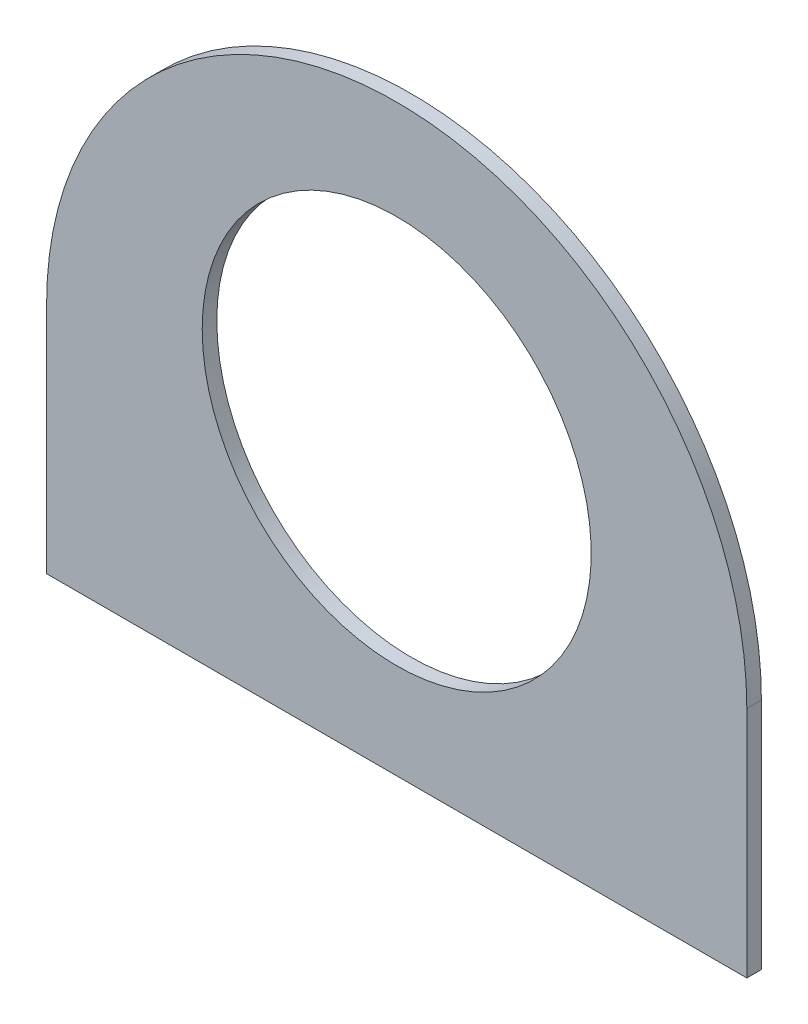
ISO-10303-21;
HEADER;
FILE_DESCRIPTION(('STEP AP214'),'2;1');
FILE_NAME('part.step','',(''),(''),'','','');
FILE_SCHEMA(('AUTOMOTIVE_DESIGN { 1 0 10303 214 1 1 1 1 }'));
ENDSEC;
DATA;
#1=APPLICATION_CONTEXT('core data for automotive mechanical design processes');
#2=APPLICATION_PROTOCOL_DEFINITION('international standard','automotive_design',2000,#1);
#3=PRODUCT_CONTEXT('',#1,'mechanical');
#4=PRODUCT('Part','Part','',(#3));
#5=PRODUCT_RELATED_PRODUCT_CATEGORY('part','',(#4));
#6=PRODUCT_DEFINITION_FORMATION('','',#4);
#7=PRODUCT_DEFINITION_CONTEXT('part definition',#1,'design');
#8=PRODUCT_DEFINITION('design','',#6,#7);
#9=PRODUCT_DEFINITION_SHAPE('','',#8);
#10=(LENGTH_UNIT() NAMED_UNIT(*) SI_UNIT(.MILLI.,.METRE.));
#11=(NAMED_UNIT(*) PLANE_ANGLE_UNIT() SI_UNIT($,.RADIAN.));
#12=(NAMED_UNIT(*) SI_UNIT($,.STERADIAN.) SOLID_ANGLE_UNIT());
#13=UNCERTAINTY_MEASURE_WITH_UNIT(LENGTH_MEASURE(1.E-05),#10,'distance_accuracy_value','');
#14=(GEOMETRIC_REPRESENTATION_CONTEXT(3) GLOBAL_UNCERTAINTY_ASSIGNED_CONTEXT((#13)) GLOBAL_UNIT_ASSIGNED_CONTEXT((#10,
#11,#12)) REPRESENTATION_CONTEXT('',''));
#15=CARTESIAN_POINT('',(0.,0.,0.));
#16=DIRECTION('',(0.,0.,1.));
#17=DIRECTION('',(1.,0.,0.));
#18=AXIS2_PLACEMENT_3D('',#15,#16,#17);
#19=CARTESIAN_POINT('',(0.,-36.83,9.525));
#20=DIRECTION('',(0.,0.,1.));
#21=DIRECTION('',(1.,0.,0.));
#22=AXIS2_PLACEMENT_3D('',#19,#20,#21);
#23=PLANE('',#22);
#24=DIRECTION('',(1.,0.,0.));
#25=VECTOR('',#24,1.);
#26=CARTESIAN_POINT('',(-228.6,-189.23,9.525));
#27=LINE('',#26,#25);
#28=CARTESIAN_POINT('',(-228.6,-189.23,9.525));
#29=VERTEX_POINT('',#28);
#30=CARTESIAN_POINT('',(228.6,-189.23,9.525));
#31=VERTEX_POINT('',#30);
#32=EDGE_CURVE('E85',#29,#31,#27,.T.);
#33=ORIENTED_EDGE('',*,*,#32,.T.);
#34=DIRECTION('',(0.,1.,0.));
#35=VECTOR('',#34,1.);
#36=CARTESIAN_POINT('',(228.6,-36.83,9.525));
#37=LINE('',#36,#35);
#38=CARTESIAN_POINT('',(228.6,-36.83,9.525));
#39=VERTEX_POINT('',#38);
#40=EDGE_CURVE('E80',#31,#39,#37,.T.);
#41=ORIENTED_EDGE('',*,*,#40,.T.);
#42=CARTESIAN_POINT('',(0.,-36.83,9.525));
#43=DIRECTION('',(0.,0.,1.));
#44=DIRECTION('',(1.,0.,0.));
#45=AXIS2_PLACEMENT_3D('',#42,#43,#44);
#46=CIRCLE('',#45,228.6);
#47=CARTESIAN_POINT('',(-228.6,-36.83,9.525));
#48=VERTEX_POINT('',#47);
#49=EDGE_CURVE('E83',#39,#48,#46,.T.);
#50=ORIENTED_EDGE('',*,*,#49,.T.);
#51=DIRECTION('',(0.,-1.,0.));
#52=VECTOR('',#51,1.);
#53=CARTESIAN_POINT('',(-228.6,-36.83,9.525));
#54=LINE('',#53,#52);
#55=EDGE_CURVE('E50',#48,#29,#54,.T.);
#56=ORIENTED_EDGE('',*,*,#55,.T.);
#57=EDGE_LOOP('',(#33,#41,#50,#56));
#58=FACE_BOUND('',#57,.T.);
#59=CARTESIAN_POINT('',(0.,0.,9.525));
#60=DIRECTION('',(0.,0.,1.));
#61=DIRECTION('',(1.,0.,0.));
#62=AXIS2_PLACEMENT_3D('',#59,#60,#61);
#63=CIRCLE('',#62,127.);
#64=CARTESIAN_POINT('',(-127.,0.,9.525));
#65=VERTEX_POINT('',#64);
#66=EDGE_CURVE('E100',#65,#65,#63,.T.);
#67=ORIENTED_EDGE('',*,*,#66,.F.);
#68=EDGE_LOOP('',(#67));
#69=FACE_BOUND('',#68,.T.);
#70=ADVANCED_FACE('F33',(#58,#69),#23,.T.);
#71=CARTESIAN_POINT('',(0.,-36.83,0.));
#72=DIRECTION('',(0.,0.,1.));
#73=DIRECTION('',(1.,0.,0.));
#74=AXIS2_PLACEMENT_3D('',#71,#72,#73);
#75=PLANE('',#74);
#76=DIRECTION('',(1.,0.,0.));
#77=VECTOR('',#76,1.);
#78=CARTESIAN_POINT('',(-228.6,-189.23,0.));
#79=LINE('',#78,#77);
#80=CARTESIAN_POINT('',(-228.6,-189.23,0.));
#81=VERTEX_POINT('',#80);
#82=CARTESIAN_POINT('',(228.6,-189.23,0.));
#83=VERTEX_POINT('',#82);
#84=EDGE_CURVE('E97',#81,#83,#79,.T.);
#85=ORIENTED_EDGE('',*,*,#84,.F.);
#86=DIRECTION('',(0.,-1.,0.));
#87=VECTOR('',#86,1.);
#88=CARTESIAN_POINT('',(-228.6,-36.83,0.));
#89=LINE('',#88,#87);
#90=CARTESIAN_POINT('',(-228.6,-36.83,0.));
#91=VERTEX_POINT('',#90);
#92=EDGE_CURVE('E73',#91,#81,#89,.T.);
#93=ORIENTED_EDGE('',*,*,#92,.F.);
#94=CARTESIAN_POINT('',(0.,-36.83,0.));
#95=DIRECTION('',(0.,0.,1.));
#96=DIRECTION('',(1.,0.,0.));
#97=AXIS2_PLACEMENT_3D('',#94,#95,#96);
#98=CIRCLE('',#97,228.6);
#99=CARTESIAN_POINT('',(228.6,-36.83,0.));
#100=VERTEX_POINT('',#99);
#101=EDGE_CURVE('E67',#100,#91,#98,.T.);
#102=ORIENTED_EDGE('',*,*,#101,.F.);
#103=DIRECTION('',(0.,1.,0.));
#104=VECTOR('',#103,1.);
#105=CARTESIAN_POINT('',(228.6,-36.83,0.));
#106=LINE('',#105,#104);
#107=EDGE_CURVE('E89',#83,#100,#106,.T.);
#108=ORIENTED_EDGE('',*,*,#107,.F.);
#109=EDGE_LOOP('',(#85,#93,#102,#108));
#110=FACE_BOUND('',#109,.T.);
#111=CARTESIAN_POINT('',(0.,0.,0.));
#112=DIRECTION('',(0.,0.,1.));
#113=DIRECTION('',(1.,0.,0.));
#114=AXIS2_PLACEMENT_3D('',#111,#112,#113);
#115=CIRCLE('',#114,127.);
#116=CARTESIAN_POINT('',(-127.,0.,0.));
#117=VERTEX_POINT('',#116);
#118=EDGE_CURVE('E112',#117,#117,#115,.T.);
#119=ORIENTED_EDGE('',*,*,#118,.T.);
#120=EDGE_LOOP('',(#119));
#121=FACE_BOUND('',#120,.T.);
#122=ADVANCED_FACE('F108',(#110,#121),#75,.F.);
#123=CARTESIAN_POINT('',(-228.6,-189.23,9.525));
#124=DIRECTION('',(0.,1.,0.));
#125=DIRECTION('',(0.,0.,1.));
#126=AXIS2_PLACEMENT_3D('',#123,#124,#125);
#127=PLANE('',#126);
#128=ORIENTED_EDGE('',*,*,#84,.T.);
#129=DIRECTION('',(0.,0.,-1.));
#130=VECTOR('',#129,1.);
#131=CARTESIAN_POINT('',(228.6,-189.23,9.525));
#132=LINE('',#131,#130);
#133=EDGE_CURVE('E11',#31,#83,#132,.T.);
#134=ORIENTED_EDGE('',*,*,#133,.F.);
#135=ORIENTED_EDGE('',*,*,#32,.F.);
#136=DIRECTION('',(0.,0.,-1.));
#137=VECTOR('',#136,1.);
#138=CARTESIAN_POINT('',(-228.6,-189.23,9.525));
#139=LINE('',#138,#137);
#140=EDGE_CURVE('E93',#29,#81,#139,.T.);
#141=ORIENTED_EDGE('',*,*,#140,.T.);
#142=EDGE_LOOP('',(#128,#134,#135,#141));
#143=FACE_BOUND('',#142,.T.);
#144=ADVANCED_FACE('F35',(#143),#127,.F.);
#145=CARTESIAN_POINT('',(228.6,-36.83,9.525));
#146=DIRECTION('',(-1.,0.,0.));
#147=DIRECTION('',(0.,-1.,0.));
#148=AXIS2_PLACEMENT_3D('',#145,#146,#147);
#149=PLANE('',#148);
#150=ORIENTED_EDGE('',*,*,#107,.T.);
#151=DIRECTION('',(0.,0.,-1.));
#152=VECTOR('',#151,1.);
#153=CARTESIAN_POINT('',(228.6,-36.83,9.525));
#154=LINE('',#153,#152);
#155=EDGE_CURVE('E42',#39,#100,#154,.T.);
#156=ORIENTED_EDGE('',*,*,#155,.F.);
#157=ORIENTED_EDGE('',*,*,#40,.F.);
#158=ORIENTED_EDGE('',*,*,#133,.T.);
#159=EDGE_LOOP('',(#150,#156,#157,#158));
#160=FACE_BOUND('',#159,.T.);
#161=ADVANCED_FACE('F88',(#160),#149,.F.);
#162=CARTESIAN_POINT('',(0.,-36.83,9.525));
#163=DIRECTION('',(0.,0.,-1.));
#164=DIRECTION('',(-1.,0.,0.));
#165=AXIS2_PLACEMENT_3D('',#162,#163,#164);
#166=CYLINDRICAL_SURFACE('',#165,228.6);
#167=ORIENTED_EDGE('',*,*,#101,.T.);
#168=DIRECTION('',(0.,0.,-1.));
#169=VECTOR('',#168,1.);
#170=CARTESIAN_POINT('',(-228.6,-36.83,9.525));
#171=LINE('',#170,#169);
#172=EDGE_CURVE('E90',#48,#91,#171,.T.);
#173=ORIENTED_EDGE('',*,*,#172,.F.);
#174=ORIENTED_EDGE('',*,*,#49,.F.);
#175=ORIENTED_EDGE('',*,*,#155,.T.);
#176=EDGE_LOOP('',(#167,#173,#174,#175));
#177=FACE_BOUND('',#176,.T.);
#178=ADVANCED_FACE('F91',(#177),#166,.T.);
#179=CARTESIAN_POINT('',(-228.6,-36.83,9.525));
#180=DIRECTION('',(1.,0.,0.));
#181=DIRECTION('',(0.,1.,0.));
#182=AXIS2_PLACEMENT_3D('',#179,#180,#181);
#183=PLANE('',#182);
#184=ORIENTED_EDGE('',*,*,#92,.T.);
#185=ORIENTED_EDGE('',*,*,#140,.F.);
#186=ORIENTED_EDGE('',*,*,#55,.F.);
#187=ORIENTED_EDGE('',*,*,#172,.T.);
#188=EDGE_LOOP('',(#184,#185,#186,#187));
#189=FACE_BOUND('',#188,.T.);
#190=ADVANCED_FACE('F105',(#189),#183,.F.);
#191=CARTESIAN_POINT('',(0.,0.,9.525));
#192=DIRECTION('',(0.,0.,-1.));
#193=DIRECTION('',(-1.,0.,0.));
#194=AXIS2_PLACEMENT_3D('',#191,#192,#193);
#195=CYLINDRICAL_SURFACE('',#194,127.);
#196=CARTESIAN_POINT('',(-127.,0.,9.525));
#197=CARTESIAN_POINT('',(-127.,0.,9.42578125));
#198=CARTESIAN_POINT('',(-127.,0.,9.3265625));
#199=CARTESIAN_POINT('',(-127.,0.,9.128125));
#200=CARTESIAN_POINT('',(-127.,0.,9.02890625));
#201=CARTESIAN_POINT('',(-127.,0.,8.83046875));
#202=CARTESIAN_POINT('',(-127.,0.,8.73125));
#203=CARTESIAN_POINT('',(-127.,0.,8.5328125));
#204=CARTESIAN_POINT('',(-127.,0.,8.43359375));
#205=CARTESIAN_POINT('',(-127.,0.,8.23515625));
#206=CARTESIAN_POINT('',(-127.,0.,8.1359375));
#207=CARTESIAN_POINT('',(-127.,0.,7.9375));
#208=CARTESIAN_POINT('',(-127.,0.,7.83828125));
#209=CARTESIAN_POINT('',(-127.,0.,7.63984375));
#210=CARTESIAN_POINT('',(-127.,0.,7.540625));
#211=CARTESIAN_POINT('',(-127.,0.,7.3421875));
#212=CARTESIAN_POINT('',(-127.,0.,7.24296875));
#213=CARTESIAN_POINT('',(-127.,0.,7.04453125));
#214=CARTESIAN_POINT('',(-127.,0.,6.9453125));
#215=CARTESIAN_POINT('',(-127.,0.,6.746875));
#216=CARTESIAN_POINT('',(-127.,0.,6.64765625));
#217=CARTESIAN_POINT('',(-127.,0.,6.44921875));
#218=CARTESIAN_POINT('',(-127.,0.,6.35));
#219=CARTESIAN_POINT('',(-127.,0.,6.1515625));
#220=CARTESIAN_POINT('',(-127.,0.,6.05234375));
#221=CARTESIAN_POINT('',(-127.,0.,5.85390625));
#222=CARTESIAN_POINT('',(-127.,0.,5.7546875));
#223=CARTESIAN_POINT('',(-127.,0.,5.55625));
#224=CARTESIAN_POINT('',(-127.,0.,5.45703125));
#225=CARTESIAN_POINT('',(-127.,0.,5.25859375));
#226=CARTESIAN_POINT('',(-127.,0.,5.159375));
#227=CARTESIAN_POINT('',(-127.,0.,4.9609375));
#228=CARTESIAN_POINT('',(-127.,0.,4.86171875));
#229=CARTESIAN_POINT('',(-127.,0.,4.66328125));
#230=CARTESIAN_POINT('',(-127.,0.,4.5640625));
#231=CARTESIAN_POINT('',(-127.,0.,4.365625));
#232=CARTESIAN_POINT('',(-127.,0.,4.26640625));
#233=CARTESIAN_POINT('',(-127.,0.,4.06796875));
#234=CARTESIAN_POINT('',(-127.,0.,3.96875));
#235=CARTESIAN_POINT('',(-127.,0.,3.7703125));
#236=CARTESIAN_POINT('',(-127.,0.,3.67109375));
#237=CARTESIAN_POINT('',(-127.,0.,3.47265625));
#238=CARTESIAN_POINT('',(-127.,0.,3.3734375));
#239=CARTESIAN_POINT('',(-127.,0.,3.175));
#240=CARTESIAN_POINT('',(-127.,0.,3.07578125));
#241=CARTESIAN_POINT('',(-127.,0.,2.87734375));
#242=CARTESIAN_POINT('',(-127.,0.,2.778125));
#243=CARTESIAN_POINT('',(-127.,0.,2.5796875));
#244=CARTESIAN_POINT('',(-127.,0.,2.48046875));
#245=CARTESIAN_POINT('',(-127.,0.,2.28203125));
#246=CARTESIAN_POINT('',(-127.,0.,2.1828125));
#247=CARTESIAN_POINT('',(-127.,0.,1.984375));
#248=CARTESIAN_POINT('',(-127.,0.,1.88515625));
#249=CARTESIAN_POINT('',(-127.,0.,1.68671875));
#250=CARTESIAN_POINT('',(-127.,0.,1.5875));
#251=CARTESIAN_POINT('',(-127.,0.,1.3890625));
#252=CARTESIAN_POINT('',(-127.,0.,1.28984375));
#253=CARTESIAN_POINT('',(-127.,0.,1.09140625));
#254=CARTESIAN_POINT('',(-127.,0.,0.992187500000001));
#255=CARTESIAN_POINT('',(-127.,0.,0.793750000000001));
#256=CARTESIAN_POINT('',(-127.,0.,0.69453125));
#257=CARTESIAN_POINT('',(-127.,0.,0.49609375));
#258=CARTESIAN_POINT('',(-127.,0.,0.396875));
#259=CARTESIAN_POINT('',(-127.,0.,0.1984375));
#260=CARTESIAN_POINT('',(-127.,0.,0.0992187500000001));
#261=CARTESIAN_POINT('',(-127.,0.,0.));
#262=B_SPLINE_CURVE_WITH_KNOTS('',3,(#196,#197,#198,#199,#200,#201,#202,#203,#204,#205,#206,
#207,#208,#209,#210,#211,#212,#213,#214,#215,#216,#217,#218,#219,#220,#221,#222,#223,#224,#225,
#226,#227,#228,#229,#230,#231,#232,#233,#234,#235,#236,#237,#238,#239,#240,#241,#242,#243,#244,
#245,#246,#247,#248,#249,#250,#251,#252,#253,#254,#255,#256,#257,#258,#259,#260,#261),
.UNSPECIFIED.,.F.,.F.,(4,2,2,2,2,2,2,2,2,2,2,2,2,2,2,2,2,2,2,2,2,2,2,2,2,2,2,2,2,2,2,2,4),(0.,
0.29765625,0.5953125,0.892968750000001,1.190625,1.48828125,1.7859375,2.08359375,2.38125,
2.67890625,2.9765625,3.27421875,3.571875,3.86953125,4.1671875,4.46484375,4.7625,5.06015625,
5.3578125,5.65546875,5.953125,6.25078125,6.5484375,6.84609375,7.14375,7.44140625,7.7390625,
8.03671875,8.334375,8.63203125,8.9296875,9.22734375,9.525),.UNSPECIFIED.);
#263=EDGE_CURVE('BSEAM118',#65,#117,#262,.T.);
#264=ORIENTED_EDGE('',*,*,#66,.T.);
#265=ORIENTED_EDGE('',*,*,#118,.F.);
#266=ORIENTED_EDGE('',*,*,#263,.T.);
#267=ORIENTED_EDGE('',*,*,#263,.F.);
#268=EDGE_LOOP('',(#264,#266,#265,#267));
#269=FACE_BOUND('',#268,.T.);
#270=ADVANCED_FACE('F118',(#269),#195,.F.);
#271=CLOSED_SHELL('',(#70,#122,#144,#161,#178,#190,#270));
#272=MANIFOLD_SOLID_BREP('B2',#271);
#273=ADVANCED_BREP_SHAPE_REPRESENTATION('',(#18,#272),#14);
#274=SHAPE_DEFINITION_REPRESENTATION(#9,#273);
ENDSEC;
END-ISO-10303-21;
